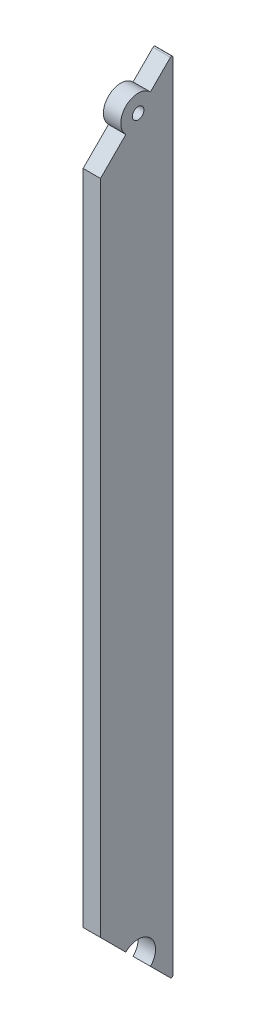
ISO-10303-21;
HEADER;
FILE_DESCRIPTION(('STEP AP214'),'2;1');
FILE_NAME('part.step','',(''),(''),'','','');
FILE_SCHEMA(('AUTOMOTIVE_DESIGN { 1 0 10303 214 1 1 1 1 }'));
ENDSEC;
DATA;
#1=APPLICATION_CONTEXT('core data for automotive mechanical design processes');
#2=APPLICATION_PROTOCOL_DEFINITION('international standard','automotive_design',2000,#1);
#3=PRODUCT_CONTEXT('',#1,'mechanical');
#4=PRODUCT('Part','Part','',(#3));
#5=PRODUCT_RELATED_PRODUCT_CATEGORY('part','',(#4));
#6=PRODUCT_DEFINITION_FORMATION('','',#4);
#7=PRODUCT_DEFINITION_CONTEXT('part definition',#1,'design');
#8=PRODUCT_DEFINITION('design','',#6,#7);
#9=PRODUCT_DEFINITION_SHAPE('','',#8);
#10=(LENGTH_UNIT() NAMED_UNIT(*) SI_UNIT(.MILLI.,.METRE.));
#11=(NAMED_UNIT(*) PLANE_ANGLE_UNIT() SI_UNIT($,.RADIAN.));
#12=(NAMED_UNIT(*) SI_UNIT($,.STERADIAN.) SOLID_ANGLE_UNIT());
#13=UNCERTAINTY_MEASURE_WITH_UNIT(LENGTH_MEASURE(1.E-05),#10,'distance_accuracy_value','');
#14=(GEOMETRIC_REPRESENTATION_CONTEXT(3) GLOBAL_UNCERTAINTY_ASSIGNED_CONTEXT((#13)) GLOBAL_UNIT_ASSIGNED_CONTEXT((#10,
#11,#12)) REPRESENTATION_CONTEXT('',''));
#15=CARTESIAN_POINT('',(0.,0.,0.));
#16=DIRECTION('',(0.,0.,1.));
#17=DIRECTION('',(1.,0.,0.));
#18=AXIS2_PLACEMENT_3D('',#15,#16,#17);
#19=CARTESIAN_POINT('',(6.,30.6749264298105,30.6749264298105));
#20=DIRECTION('',(0.,0.707106781186549,-0.707106781186546));
#21=DIRECTION('',(0.,0.707106781186546,0.707106781186549));
#22=AXIS2_PLACEMENT_3D('',#19,#20,#21);
#23=PLANE('',#22);
#24=DIRECTION('',(0.,-0.707106781186546,-0.707106781186549));
#25=VECTOR('',#24,1.);
#26=CARTESIAN_POINT('',(0.,30.6749264298105,30.6749264298105));
#27=LINE('',#26,#25);
#28=CARTESIAN_POINT('',(0.,30.6749264298105,30.6749264298105));
#29=VERTEX_POINT('',#28);
#30=CARTESIAN_POINT('',(0.,21.9175671169298,21.9175671169298));
#31=VERTEX_POINT('',#30);
#32=EDGE_CURVE('E133',#29,#31,#27,.T.);
#33=ORIENTED_EDGE('',*,*,#32,.T.);
#34=DIRECTION('',(1.,0.,0.));
#35=VECTOR('',#34,1.);
#36=CARTESIAN_POINT('',(0.,21.9175671169298,21.9175671169298));
#37=LINE('',#36,#35);
#38=CARTESIAN_POINT('',(6.,21.9175671169298,21.9175671169298));
#39=VERTEX_POINT('',#38);
#40=EDGE_CURVE('E54',#31,#39,#37,.T.);
#41=ORIENTED_EDGE('',*,*,#40,.T.);
#42=DIRECTION('',(0.,-0.707106781186546,-0.707106781186549));
#43=VECTOR('',#42,1.);
#44=CARTESIAN_POINT('',(6.,30.6749264298105,30.6749264298105));
#45=LINE('',#44,#43);
#46=CARTESIAN_POINT('',(6.,30.6749264298105,30.6749264298105));
#47=VERTEX_POINT('',#46);
#48=EDGE_CURVE('E192',#47,#39,#45,.T.);
#49=ORIENTED_EDGE('',*,*,#48,.F.);
#50=DIRECTION('',(-1.,0.,0.));
#51=VECTOR('',#50,1.);
#52=CARTESIAN_POINT('',(6.,30.6749264298105,30.6749264298105));
#53=LINE('',#52,#51);
#54=EDGE_CURVE('E155',#47,#29,#53,.T.);
#55=ORIENTED_EDGE('',*,*,#54,.T.);
#56=EDGE_LOOP('',(#33,#41,#49,#55));
#57=FACE_BOUND('',#56,.T.);
#58=ADVANCED_FACE('F37',(#57),#23,.F.);
#59=CARTESIAN_POINT('',(6.,257.67492642981,30.6749264298105));
#60=DIRECTION('',(0.,-0.707106781186543,-0.707106781186552));
#61=DIRECTION('',(0.,0.707106781186552,-0.707106781186543));
#62=AXIS2_PLACEMENT_3D('',#59,#60,#61);
#63=PLANE('',#62);
#64=DIRECTION('',(0.,-0.707106781186552,0.707106781186543));
#65=VECTOR('',#64,1.);
#66=CARTESIAN_POINT('',(0.,257.67492642981,30.6749264298105));
#67=LINE('',#66,#65);
#68=CARTESIAN_POINT('',(0.,281.821373039217,6.52847982040379));
#69=VERTEX_POINT('',#68);
#70=CARTESIAN_POINT('',(0.,274.91756711693,13.4322857426912));
#71=VERTEX_POINT('',#70);
#72=EDGE_CURVE('E147',#69,#71,#67,.T.);
#73=ORIENTED_EDGE('',*,*,#72,.T.);
#74=DIRECTION('',(1.,0.,0.));
#75=VECTOR('',#74,1.);
#76=CARTESIAN_POINT('',(-16.9705627484771,274.91756711693,13.4322857426912));
#77=LINE('',#76,#75);
#78=CARTESIAN_POINT('',(6.,274.91756711693,13.4322857426912));
#79=VERTEX_POINT('',#78);
#80=EDGE_CURVE('E139',#71,#79,#77,.T.);
#81=ORIENTED_EDGE('',*,*,#80,.T.);
#82=DIRECTION('',(0.,-0.707106781186552,0.707106781186543));
#83=VECTOR('',#82,1.);
#84=CARTESIAN_POINT('',(6.,257.67492642981,30.6749264298105));
#85=LINE('',#84,#83);
#86=CARTESIAN_POINT('',(6.,281.821373039217,6.52847982040379));
#87=VERTEX_POINT('',#86);
#88=EDGE_CURVE('E179',#87,#79,#85,.T.);
#89=ORIENTED_EDGE('',*,*,#88,.F.);
#90=DIRECTION('',(-1.,0.,0.));
#91=VECTOR('',#90,1.);
#92=CARTESIAN_POINT('',(6.,281.821373039217,6.52847982040379));
#93=LINE('',#92,#91);
#94=EDGE_CURVE('E48',#87,#69,#93,.T.);
#95=ORIENTED_EDGE('',*,*,#94,.T.);
#96=EDGE_LOOP('',(#73,#81,#89,#95));
#97=FACE_BOUND('',#96,.T.);
#98=ADVANCED_FACE('F178',(#97),#63,.F.);
#99=CARTESIAN_POINT('',(6.,13.4322857426912,13.4322857426912));
#100=VERTEX_POINT('',#99);
#101=CARTESIAN_POINT('',(6.,6.5284798204038,6.52847982040374));
#102=VERTEX_POINT('',#101);
#103=EDGE_CURVE('E127',#100,#102,#45,.T.);
#104=ORIENTED_EDGE('',*,*,#103,.F.);
#105=DIRECTION('',(1.,0.,0.));
#106=VECTOR('',#105,1.);
#107=CARTESIAN_POINT('',(0.,13.4322857426912,13.4322857426912));
#108=LINE('',#107,#106);
#109=CARTESIAN_POINT('',(0.,13.4322857426912,13.4322857426912));
#110=VERTEX_POINT('',#109);
#111=EDGE_CURVE('E116',#100,#110,#108,.F.);
#112=ORIENTED_EDGE('',*,*,#111,.T.);
#113=CARTESIAN_POINT('',(0.,6.5284798204038,6.52847982040374));
#114=VERTEX_POINT('',#113);
#115=EDGE_CURVE('E126',#110,#114,#27,.T.);
#116=ORIENTED_EDGE('',*,*,#115,.T.);
#117=DIRECTION('',(-1.,0.,0.));
#118=VECTOR('',#117,1.);
#119=CARTESIAN_POINT('',(6.,6.52847982040379,6.52847982040374));
#120=LINE('',#119,#118);
#121=EDGE_CURVE('E169',#114,#102,#120,.F.);
#122=ORIENTED_EDGE('',*,*,#121,.T.);
#123=EDGE_LOOP('',(#104,#112,#116,#122));
#124=FACE_BOUND('',#123,.T.);
#125=ADVANCED_FACE('F122',(#124),#23,.F.);
#126=CARTESIAN_POINT('',(6.,282.674926429811,5.67492642981051));
#127=DIRECTION('',(0.,0.,1.));
#128=DIRECTION('',(0.,-1.,0.));
#129=AXIS2_PLACEMENT_3D('',#126,#127,#128);
#130=PLANE('',#129);
#131=DIRECTION('',(0.,1.,0.));
#132=VECTOR('',#131,1.);
#133=CARTESIAN_POINT('',(6.,282.674926429811,5.67492642981051));
#134=LINE('',#133,#132);
#135=CARTESIAN_POINT('',(6.,6.88203321099706,5.67492642981048));
#136=VERTEX_POINT('',#135);
#137=CARTESIAN_POINT('',(6.,281.467819648624,5.67492642981051));
#138=VERTEX_POINT('',#137);
#139=EDGE_CURVE('E200',#136,#138,#134,.T.);
#140=ORIENTED_EDGE('',*,*,#139,.F.);
#141=DIRECTION('',(-1.,0.,0.));
#142=VECTOR('',#141,1.);
#143=CARTESIAN_POINT('',(6.,6.88203321099706,5.67492642981048));
#144=LINE('',#143,#142);
#145=CARTESIAN_POINT('',(0.,6.88203321099706,5.67492642981048));
#146=VERTEX_POINT('',#145);
#147=EDGE_CURVE('E158',#136,#146,#144,.T.);
#148=ORIENTED_EDGE('',*,*,#147,.T.);
#149=DIRECTION('',(0.,1.,0.));
#150=VECTOR('',#149,1.);
#151=CARTESIAN_POINT('',(0.,282.674926429811,5.67492642981051));
#152=LINE('',#151,#150);
#153=CARTESIAN_POINT('',(0.,281.467819648624,5.67492642981051));
#154=VERTEX_POINT('',#153);
#155=EDGE_CURVE('E140',#146,#154,#152,.T.);
#156=ORIENTED_EDGE('',*,*,#155,.T.);
#157=DIRECTION('',(-1.,0.,0.));
#158=VECTOR('',#157,1.);
#159=CARTESIAN_POINT('',(6.,281.467819648624,5.67492642981051));
#160=LINE('',#159,#158);
#161=EDGE_CURVE('E156',#154,#138,#160,.F.);
#162=ORIENTED_EDGE('',*,*,#161,.T.);
#163=EDGE_LOOP('',(#140,#148,#156,#162));
#164=FACE_BOUND('',#163,.T.);
#165=ADVANCED_FACE('F243',(#164),#130,.F.);
#166=CARTESIAN_POINT('',(6.,266.432285742691,21.9175671169297));
#167=VERTEX_POINT('',#166);
#168=CARTESIAN_POINT('',(6.,257.67492642981,30.6749264298105));
#169=VERTEX_POINT('',#168);
#170=EDGE_CURVE('E61',#167,#169,#85,.T.);
#171=ORIENTED_EDGE('',*,*,#170,.F.);
#172=DIRECTION('',(1.,0.,0.));
#173=VECTOR('',#172,1.);
#174=CARTESIAN_POINT('',(-16.9705627484771,266.432285742691,21.9175671169297));
#175=LINE('',#174,#173);
#176=CARTESIAN_POINT('',(0.,266.432285742691,21.9175671169297));
#177=VERTEX_POINT('',#176);
#178=EDGE_CURVE('E138',#167,#177,#175,.F.);
#179=ORIENTED_EDGE('',*,*,#178,.T.);
#180=CARTESIAN_POINT('',(0.,257.67492642981,30.6749264298105));
#181=VERTEX_POINT('',#180);
#182=EDGE_CURVE('E150',#177,#181,#67,.T.);
#183=ORIENTED_EDGE('',*,*,#182,.T.);
#184=DIRECTION('',(-1.,0.,0.));
#185=VECTOR('',#184,1.);
#186=CARTESIAN_POINT('',(6.,257.67492642981,30.6749264298105));
#187=LINE('',#186,#185);
#188=EDGE_CURVE('E152',#169,#181,#187,.T.);
#189=ORIENTED_EDGE('',*,*,#188,.F.);
#190=EDGE_LOOP('',(#171,#179,#183,#189));
#191=FACE_BOUND('',#190,.T.);
#192=ADVANCED_FACE('F203',(#191),#63,.F.);
#193=CARTESIAN_POINT('',(6.,30.6749264298105,30.6749264298105));
#194=DIRECTION('',(0.,0.,-1.));
#195=DIRECTION('',(-1.,0.,0.));
#196=AXIS2_PLACEMENT_3D('',#193,#194,#195);
#197=PLANE('',#196);
#198=DIRECTION('',(0.,-1.,0.));
#199=VECTOR('',#198,1.);
#200=CARTESIAN_POINT('',(0.,30.6749264298105,30.6749264298105));
#201=LINE('',#200,#199);
#202=EDGE_CURVE('E149',#181,#29,#201,.T.);
#203=ORIENTED_EDGE('',*,*,#202,.T.);
#204=ORIENTED_EDGE('',*,*,#54,.F.);
#205=DIRECTION('',(0.,-1.,0.));
#206=VECTOR('',#205,1.);
#207=CARTESIAN_POINT('',(6.,30.6749264298105,30.6749264298105));
#208=LINE('',#207,#206);
#209=EDGE_CURVE('E145',#169,#47,#208,.T.);
#210=ORIENTED_EDGE('',*,*,#209,.F.);
#211=ORIENTED_EDGE('',*,*,#188,.T.);
#212=EDGE_LOOP('',(#203,#204,#210,#211));
#213=FACE_BOUND('',#212,.T.);
#214=ADVANCED_FACE('F207',(#213),#197,.F.);
#215=CARTESIAN_POINT('',(6.,0.,0.));
#216=DIRECTION('',(1.,0.,0.));
#217=DIRECTION('',(0.,0.,-1.));
#218=AXIS2_PLACEMENT_3D('',#215,#216,#217);
#219=PLANE('',#218);
#220=CARTESIAN_POINT('',(6.,270.67492642981,17.6749264298102));
#221=DIRECTION('',(1.,0.,0.));
#222=DIRECTION('',(0.,0.,-1.));
#223=AXIS2_PLACEMENT_3D('',#220,#221,#222);
#224=CIRCLE('',#223,2.);
#225=CARTESIAN_POINT('',(6.,270.67492642981,15.6749264298102));
#226=VERTEX_POINT('',#225);
#227=EDGE_CURVE('E208',#226,#226,#224,.T.);
#228=ORIENTED_EDGE('',*,*,#227,.F.);
#229=EDGE_LOOP('',(#228));
#230=FACE_BOUND('',#229,.T.);
#231=CARTESIAN_POINT('',(6.,17.6749264298105,17.6749264298105));
#232=DIRECTION('',(1.,0.,0.));
#233=DIRECTION('',(0.,0.,-1.));
#234=AXIS2_PLACEMENT_3D('',#231,#232,#233);
#235=CIRCLE('',#234,6.);
#236=EDGE_CURVE('E206',#100,#39,#235,.T.);
#237=ORIENTED_EDGE('',*,*,#236,.F.);
#238=ORIENTED_EDGE('',*,*,#103,.T.);
#239=CARTESIAN_POINT('',(6.,6.88203321099706,6.17492642981048));
#240=DIRECTION('',(1.,0.,0.));
#241=DIRECTION('',(0.,0.,-1.));
#242=AXIS2_PLACEMENT_3D('',#239,#240,#241);
#243=CIRCLE('',#242,0.5);
#244=EDGE_CURVE('E167',#102,#136,#243,.T.);
#245=ORIENTED_EDGE('',*,*,#244,.T.);
#246=ORIENTED_EDGE('',*,*,#139,.T.);
#247=CARTESIAN_POINT('',(6.,281.467819648624,6.17492642981051));
#248=DIRECTION('',(1.,0.,0.));
#249=DIRECTION('',(0.,0.,-1.));
#250=AXIS2_PLACEMENT_3D('',#247,#248,#249);
#251=CIRCLE('',#250,0.5);
#252=EDGE_CURVE('E170',#138,#87,#251,.T.);
#253=ORIENTED_EDGE('',*,*,#252,.T.);
#254=ORIENTED_EDGE('',*,*,#88,.T.);
#255=CARTESIAN_POINT('',(6.,270.67492642981,17.6749264298102));
#256=DIRECTION('',(1.,0.,0.));
#257=DIRECTION('',(0.,0.,-1.));
#258=AXIS2_PLACEMENT_3D('',#255,#256,#257);
#259=CIRCLE('',#258,6.);
#260=EDGE_CURVE('E190',#79,#167,#259,.T.);
#261=ORIENTED_EDGE('',*,*,#260,.T.);
#262=ORIENTED_EDGE('',*,*,#170,.T.);
#263=ORIENTED_EDGE('',*,*,#209,.T.);
#264=ORIENTED_EDGE('',*,*,#48,.T.);
#265=EDGE_LOOP('',(#237,#238,#245,#246,#253,#254,#261,#262,#263,#264));
#266=FACE_BOUND('',#265,.T.);
#267=ADVANCED_FACE('F201',(#230,#266),#219,.T.);
#268=CARTESIAN_POINT('',(0.,0.,0.));
#269=DIRECTION('',(1.,0.,0.));
#270=DIRECTION('',(0.,0.,-1.));
#271=AXIS2_PLACEMENT_3D('',#268,#269,#270);
#272=PLANE('',#271);
#273=CARTESIAN_POINT('',(0.,270.67492642981,17.6749264298102));
#274=DIRECTION('',(1.,0.,0.));
#275=DIRECTION('',(0.,0.,-1.));
#276=AXIS2_PLACEMENT_3D('',#273,#274,#275);
#277=CIRCLE('',#276,2.);
#278=CARTESIAN_POINT('',(0.,270.67492642981,15.6749264298102));
#279=VERTEX_POINT('',#278);
#280=EDGE_CURVE('E128',#279,#279,#277,.T.);
#281=ORIENTED_EDGE('',*,*,#280,.T.);
#282=EDGE_LOOP('',(#281));
#283=FACE_BOUND('',#282,.T.);
#284=ORIENTED_EDGE('',*,*,#115,.F.);
#285=CARTESIAN_POINT('',(0.,17.6749264298105,17.6749264298105));
#286=DIRECTION('',(1.,0.,0.));
#287=DIRECTION('',(0.,0.,-1.));
#288=AXIS2_PLACEMENT_3D('',#285,#286,#287);
#289=CIRCLE('',#288,6.);
#290=EDGE_CURVE('E12',#110,#31,#289,.T.);
#291=ORIENTED_EDGE('',*,*,#290,.T.);
#292=ORIENTED_EDGE('',*,*,#32,.F.);
#293=ORIENTED_EDGE('',*,*,#202,.F.);
#294=ORIENTED_EDGE('',*,*,#182,.F.);
#295=CARTESIAN_POINT('',(0.,270.67492642981,17.6749264298102));
#296=DIRECTION('',(1.,0.,0.));
#297=DIRECTION('',(0.,0.,-1.));
#298=AXIS2_PLACEMENT_3D('',#295,#296,#297);
#299=CIRCLE('',#298,6.);
#300=EDGE_CURVE('E185',#177,#71,#299,.F.);
#301=ORIENTED_EDGE('',*,*,#300,.T.);
#302=ORIENTED_EDGE('',*,*,#72,.F.);
#303=CARTESIAN_POINT('',(0.,281.467819648624,6.17492642981051));
#304=DIRECTION('',(1.,0.,0.));
#305=DIRECTION('',(0.,0.,-1.));
#306=AXIS2_PLACEMENT_3D('',#303,#304,#305);
#307=CIRCLE('',#306,0.5);
#308=EDGE_CURVE('E165',#69,#154,#307,.F.);
#309=ORIENTED_EDGE('',*,*,#308,.T.);
#310=ORIENTED_EDGE('',*,*,#155,.F.);
#311=CARTESIAN_POINT('',(0.,6.88203321099706,6.17492642981048));
#312=DIRECTION('',(1.,0.,0.));
#313=DIRECTION('',(0.,0.,-1.));
#314=AXIS2_PLACEMENT_3D('',#311,#312,#313);
#315=CIRCLE('',#314,0.5);
#316=EDGE_CURVE('E134',#146,#114,#315,.F.);
#317=ORIENTED_EDGE('',*,*,#316,.T.);
#318=EDGE_LOOP('',(#284,#291,#292,#293,#294,#301,#302,#309,#310,#317));
#319=FACE_BOUND('',#318,.T.);
#320=ADVANCED_FACE('F132',(#283,#319),#272,.F.);
#321=CARTESIAN_POINT('',(6.,6.88203321099706,6.17492642981048));
#322=DIRECTION('',(-1.,0.,0.));
#323=DIRECTION('',(0.,0.,1.));
#324=AXIS2_PLACEMENT_3D('',#321,#322,#323);
#325=CYLINDRICAL_SURFACE('',#324,0.5);
#326=ORIENTED_EDGE('',*,*,#244,.F.);
#327=ORIENTED_EDGE('',*,*,#121,.F.);
#328=ORIENTED_EDGE('',*,*,#316,.F.);
#329=ORIENTED_EDGE('',*,*,#147,.F.);
#330=EDGE_LOOP('',(#326,#327,#328,#329));
#331=FACE_BOUND('',#330,.T.);
#332=ADVANCED_FACE('F232',(#331),#325,.T.);
#333=CARTESIAN_POINT('',(6.,281.467819648624,6.17492642981051));
#334=DIRECTION('',(-1.,0.,0.));
#335=DIRECTION('',(0.,0.,1.));
#336=AXIS2_PLACEMENT_3D('',#333,#334,#335);
#337=CYLINDRICAL_SURFACE('',#336,0.5);
#338=ORIENTED_EDGE('',*,*,#252,.F.);
#339=ORIENTED_EDGE('',*,*,#161,.F.);
#340=ORIENTED_EDGE('',*,*,#308,.F.);
#341=ORIENTED_EDGE('',*,*,#94,.F.);
#342=EDGE_LOOP('',(#338,#339,#340,#341));
#343=FACE_BOUND('',#342,.T.);
#344=ADVANCED_FACE('F45',(#343),#337,.T.);
#345=CARTESIAN_POINT('',(-16.9705627484771,270.67492642981,17.6749264298102));
#346=DIRECTION('',(1.,0.,0.));
#347=DIRECTION('',(0.,0.,-1.));
#348=AXIS2_PLACEMENT_3D('',#345,#346,#347);
#349=CYLINDRICAL_SURFACE('',#348,6.);
#350=ORIENTED_EDGE('',*,*,#80,.F.);
#351=ORIENTED_EDGE('',*,*,#300,.F.);
#352=ORIENTED_EDGE('',*,*,#178,.F.);
#353=ORIENTED_EDGE('',*,*,#260,.F.);
#354=EDGE_LOOP('',(#350,#351,#352,#353));
#355=FACE_BOUND('',#354,.T.);
#356=ADVANCED_FACE('F263',(#355),#349,.T.);
#357=CARTESIAN_POINT('',(0.,17.6749264298105,17.6749264298105));
#358=DIRECTION('',(1.,0.,0.));
#359=DIRECTION('',(0.,0.,-1.));
#360=AXIS2_PLACEMENT_3D('',#357,#358,#359);
#361=CYLINDRICAL_SURFACE('',#360,6.);
#362=ORIENTED_EDGE('',*,*,#290,.F.);
#363=ORIENTED_EDGE('',*,*,#111,.F.);
#364=ORIENTED_EDGE('',*,*,#236,.T.);
#365=ORIENTED_EDGE('',*,*,#40,.F.);
#366=EDGE_LOOP('',(#362,#363,#364,#365));
#367=FACE_BOUND('',#366,.T.);
#368=ADVANCED_FACE('F112',(#367),#361,.F.);
#369=CARTESIAN_POINT('',(0.,270.67492642981,17.6749264298102));
#370=DIRECTION('',(1.,0.,0.));
#371=DIRECTION('',(0.,0.,-1.));
#372=AXIS2_PLACEMENT_3D('',#369,#370,#371);
#373=CYLINDRICAL_SURFACE('',#372,2.);
#374=ORIENTED_EDGE('',*,*,#280,.F.);
#375=EDGE_LOOP('',(#374));
#376=FACE_BOUND('',#375,.T.);
#377=ORIENTED_EDGE('',*,*,#227,.T.);
#378=EDGE_LOOP('',(#377));
#379=FACE_BOUND('',#378,.T.);
#380=ADVANCED_FACE('F218',(#376,#379),#373,.F.);
#381=CLOSED_SHELL('',(#58,#98,#125,#165,#192,#214,#267,#320,#332,#344,#356,#368,#380));
#382=MANIFOLD_SOLID_BREP('B2',#381);
#383=ADVANCED_BREP_SHAPE_REPRESENTATION('',(#18,#382),#14);
#384=SHAPE_DEFINITION_REPRESENTATION(#9,#383);
ENDSEC;
END-ISO-10303-21;
